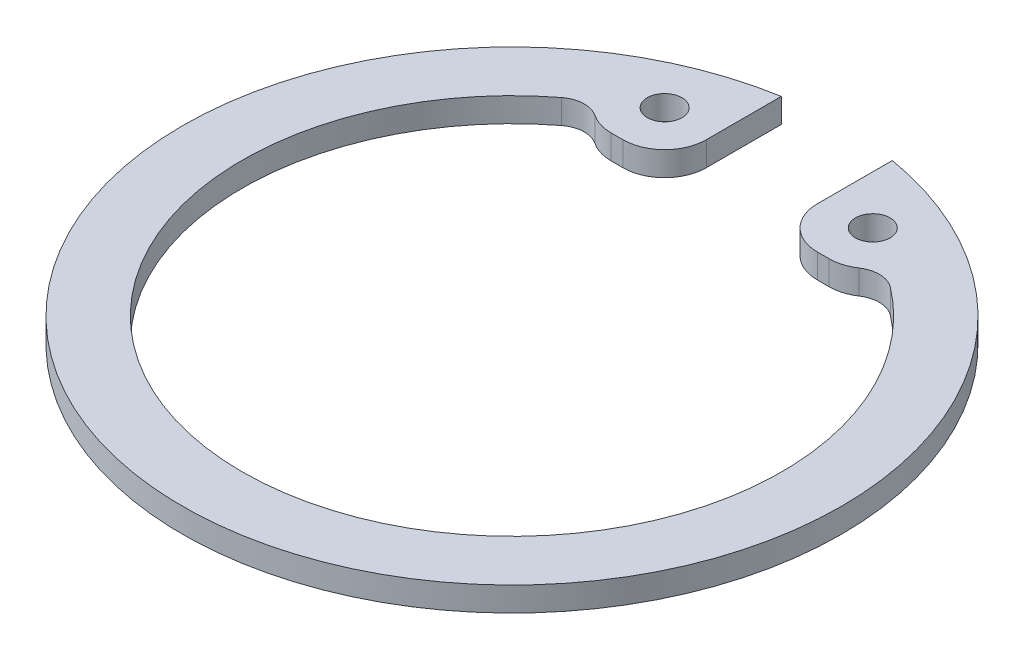
ISO-10303-21;
HEADER;
FILE_DESCRIPTION(('STEP AP214'),'2;1');
FILE_NAME('part.step','',(''),(''),'','','');
FILE_SCHEMA(('AUTOMOTIVE_DESIGN { 1 0 10303 214 1 1 1 1 }'));
ENDSEC;
DATA;
#1=APPLICATION_CONTEXT('core data for automotive mechanical design processes');
#2=APPLICATION_PROTOCOL_DEFINITION('international standard','automotive_design',2000,#1);
#3=PRODUCT_CONTEXT('',#1,'mechanical');
#4=PRODUCT('Part','Part','',(#3));
#5=PRODUCT_RELATED_PRODUCT_CATEGORY('part','',(#4));
#6=PRODUCT_DEFINITION_FORMATION('','',#4);
#7=PRODUCT_DEFINITION_CONTEXT('part definition',#1,'design');
#8=PRODUCT_DEFINITION('design','',#6,#7);
#9=PRODUCT_DEFINITION_SHAPE('','',#8);
#10=(LENGTH_UNIT() NAMED_UNIT(*) SI_UNIT(.MILLI.,.METRE.));
#11=(NAMED_UNIT(*) PLANE_ANGLE_UNIT() SI_UNIT($,.RADIAN.));
#12=(NAMED_UNIT(*) SI_UNIT($,.STERADIAN.) SOLID_ANGLE_UNIT());
#13=UNCERTAINTY_MEASURE_WITH_UNIT(LENGTH_MEASURE(1.E-05),#10,'distance_accuracy_value','');
#14=(GEOMETRIC_REPRESENTATION_CONTEXT(3) GLOBAL_UNCERTAINTY_ASSIGNED_CONTEXT((#13)) GLOBAL_UNIT_ASSIGNED_CONTEXT((#10,
#11,#12)) REPRESENTATION_CONTEXT('',''));
#15=CARTESIAN_POINT('',(0.,0.,0.));
#16=DIRECTION('',(0.,0.,1.));
#17=DIRECTION('',(1.,0.,0.));
#18=AXIS2_PLACEMENT_3D('',#15,#16,#17);
#19=CARTESIAN_POINT('',(-4.,1.75,-15.));
#20=DIRECTION('',(0.,0.,-1.));
#21=DIRECTION('',(-1.,0.,0.));
#22=AXIS2_PLACEMENT_3D('',#19,#20,#21);
#23=PLANE('',#22);
#24=DIRECTION('',(1.,0.,0.));
#25=VECTOR('',#24,1.);
#26=CARTESIAN_POINT('',(-4.,0.,-15.));
#27=LINE('',#26,#25);
#28=CARTESIAN_POINT('',(-7.85579068601217,0.,-15.));
#29=VERTEX_POINT('',#28);
#30=CARTESIAN_POINT('',(-7.,0.,-15.));
#31=VERTEX_POINT('',#30);
#32=EDGE_CURVE('E165',#29,#31,#27,.T.);
#33=ORIENTED_EDGE('',*,*,#32,.T.);
#34=DIRECTION('',(0.,-1.,0.));
#35=VECTOR('',#34,1.);
#36=CARTESIAN_POINT('',(-7.,1.75,-15.));
#37=LINE('',#36,#35);
#38=CARTESIAN_POINT('',(-7.,1.75,-15.));
#39=VERTEX_POINT('',#38);
#40=EDGE_CURVE('E45',#31,#39,#37,.F.);
#41=ORIENTED_EDGE('',*,*,#40,.T.);
#42=DIRECTION('',(1.,0.,0.));
#43=VECTOR('',#42,1.);
#44=CARTESIAN_POINT('',(-4.,1.75,-15.));
#45=LINE('',#44,#43);
#46=CARTESIAN_POINT('',(-7.85579068601217,1.75,-15.));
#47=VERTEX_POINT('',#46);
#48=EDGE_CURVE('E140',#47,#39,#45,.T.);
#49=ORIENTED_EDGE('',*,*,#48,.F.);
#50=DIRECTION('',(0.,-1.,0.));
#51=VECTOR('',#50,1.);
#52=CARTESIAN_POINT('',(-7.85579068601217,1.75,-15.));
#53=LINE('',#52,#51);
#54=EDGE_CURVE('E220',#47,#29,#53,.T.);
#55=ORIENTED_EDGE('',*,*,#54,.T.);
#56=EDGE_LOOP('',(#33,#41,#49,#55));
#57=FACE_BOUND('',#56,.T.);
#58=ADVANCED_FACE('F37',(#57),#23,.F.);
#59=CARTESIAN_POINT('',(-4.,1.75,-23.4107347172189));
#60=DIRECTION('',(-1.,0.,0.));
#61=DIRECTION('',(0.,0.,1.));
#62=AXIS2_PLACEMENT_3D('',#59,#60,#61);
#63=PLANE('',#62);
#64=DIRECTION('',(0.,0.,-1.));
#65=VECTOR('',#64,1.);
#66=CARTESIAN_POINT('',(-4.,1.75,-19.0342454539181));
#67=LINE('',#66,#65);
#68=CARTESIAN_POINT('',(-4.,1.75,-18.));
#69=VERTEX_POINT('',#68);
#70=CARTESIAN_POINT('',(-4.,1.75,-23.4107347172189));
#71=VERTEX_POINT('',#70);
#72=EDGE_CURVE('E127',#69,#71,#67,.T.);
#73=ORIENTED_EDGE('',*,*,#72,.F.);
#74=DIRECTION('',(0.,-1.,0.));
#75=VECTOR('',#74,1.);
#76=CARTESIAN_POINT('',(-4.,1.75,-18.));
#77=LINE('',#76,#75);
#78=CARTESIAN_POINT('',(-4.,0.,-18.));
#79=VERTEX_POINT('',#78);
#80=EDGE_CURVE('E218',#69,#79,#77,.T.);
#81=ORIENTED_EDGE('',*,*,#80,.T.);
#82=DIRECTION('',(0.,0.,-1.));
#83=VECTOR('',#82,1.);
#84=CARTESIAN_POINT('',(-4.,0.,-23.4107347172189));
#85=LINE('',#84,#83);
#86=CARTESIAN_POINT('',(-4.,0.,-23.4107347172189));
#87=VERTEX_POINT('',#86);
#88=EDGE_CURVE('E146',#79,#87,#85,.T.);
#89=ORIENTED_EDGE('',*,*,#88,.T.);
#90=DIRECTION('',(0.,-1.,0.));
#91=VECTOR('',#90,1.);
#92=CARTESIAN_POINT('',(-4.,1.75,-23.4107347172189));
#93=LINE('',#92,#91);
#94=EDGE_CURVE('E143',#71,#87,#93,.T.);
#95=ORIENTED_EDGE('',*,*,#94,.F.);
#96=EDGE_LOOP('',(#73,#81,#89,#95));
#97=FACE_BOUND('',#96,.T.);
#98=ADVANCED_FACE('F144',(#97),#63,.F.);
#99=CARTESIAN_POINT('',(0.,1.75,0.));
#100=DIRECTION('',(0.,-1.,0.));
#101=DIRECTION('',(0.,0.,-1.));
#102=AXIS2_PLACEMENT_3D('',#99,#100,#101);
#103=CYLINDRICAL_SURFACE('',#102,23.75);
#104=CARTESIAN_POINT('',(0.,0.,0.));
#105=DIRECTION('',(0.,1.,0.));
#106=DIRECTION('',(0.,0.,1.));
#107=AXIS2_PLACEMENT_3D('',#104,#105,#106);
#108=CIRCLE('',#107,23.75);
#109=CARTESIAN_POINT('',(3.99999999999998,0.,-23.4107347172189));
#110=VERTEX_POINT('',#109);
#111=EDGE_CURVE('E170',#87,#110,#108,.T.);
#112=ORIENTED_EDGE('',*,*,#111,.T.);
#113=DIRECTION('',(0.,-1.,0.));
#114=VECTOR('',#113,1.);
#115=CARTESIAN_POINT('',(3.99999999999998,1.75,-23.4107347172189));
#116=LINE('',#115,#114);
#117=CARTESIAN_POINT('',(3.99999999999998,1.75,-23.4107347172189));
#118=VERTEX_POINT('',#117);
#119=EDGE_CURVE('E151',#118,#110,#116,.T.);
#120=ORIENTED_EDGE('',*,*,#119,.F.);
#121=CARTESIAN_POINT('',(0.,1.75,0.));
#122=DIRECTION('',(0.,1.,0.));
#123=DIRECTION('',(0.,0.,1.));
#124=AXIS2_PLACEMENT_3D('',#121,#122,#123);
#125=CIRCLE('',#124,23.75);
#126=EDGE_CURVE('E132',#71,#118,#125,.T.);
#127=ORIENTED_EDGE('',*,*,#126,.F.);
#128=ORIENTED_EDGE('',*,*,#94,.T.);
#129=EDGE_LOOP('',(#112,#120,#127,#128));
#130=FACE_BOUND('',#129,.T.);
#131=ADVANCED_FACE('F153',(#130),#103,.T.);
#132=CARTESIAN_POINT('',(4.,1.75,-19.034245453918));
#133=DIRECTION('',(1.,0.,0.));
#134=DIRECTION('',(0.,0.,-1.));
#135=AXIS2_PLACEMENT_3D('',#132,#133,#134);
#136=PLANE('',#135);
#137=DIRECTION('',(0.,0.,1.));
#138=VECTOR('',#137,1.);
#139=CARTESIAN_POINT('',(4.,0.,-19.034245453918));
#140=LINE('',#139,#138);
#141=CARTESIAN_POINT('',(4.,0.,-18.));
#142=VERTEX_POINT('',#141);
#143=EDGE_CURVE('E172',#110,#142,#140,.T.);
#144=ORIENTED_EDGE('',*,*,#143,.T.);
#145=DIRECTION('',(0.,-1.,0.));
#146=VECTOR('',#145,1.);
#147=CARTESIAN_POINT('',(4.,1.75,-18.));
#148=LINE('',#147,#146);
#149=CARTESIAN_POINT('',(4.,1.75,-18.));
#150=VERTEX_POINT('',#149);
#151=EDGE_CURVE('E58',#142,#150,#148,.F.);
#152=ORIENTED_EDGE('',*,*,#151,.T.);
#153=DIRECTION('',(0.,0.,1.));
#154=VECTOR('',#153,1.);
#155=CARTESIAN_POINT('',(4.,1.75,-23.4107347172189));
#156=LINE('',#155,#154);
#157=EDGE_CURVE('E155',#118,#150,#156,.T.);
#158=ORIENTED_EDGE('',*,*,#157,.F.);
#159=ORIENTED_EDGE('',*,*,#119,.T.);
#160=EDGE_LOOP('',(#144,#152,#158,#159));
#161=FACE_BOUND('',#160,.T.);
#162=ADVANCED_FACE('F232',(#161),#136,.F.);
#163=CARTESIAN_POINT('',(4.,1.75,-15.));
#164=DIRECTION('',(0.,0.,-1.));
#165=DIRECTION('',(-1.,0.,0.));
#166=AXIS2_PLACEMENT_3D('',#163,#164,#165);
#167=PLANE('',#166);
#168=DIRECTION('',(1.,0.,0.));
#169=VECTOR('',#168,1.);
#170=CARTESIAN_POINT('',(4.,0.,-15.));
#171=LINE('',#170,#169);
#172=CARTESIAN_POINT('',(7.,0.,-15.));
#173=VERTEX_POINT('',#172);
#174=CARTESIAN_POINT('',(7.85579068601215,0.,-15.));
#175=VERTEX_POINT('',#174);
#176=EDGE_CURVE('E174',#173,#175,#171,.T.);
#177=ORIENTED_EDGE('',*,*,#176,.T.);
#178=DIRECTION('',(0.,-1.,0.));
#179=VECTOR('',#178,1.);
#180=CARTESIAN_POINT('',(7.85579068601215,1.75,-15.));
#181=LINE('',#180,#179);
#182=CARTESIAN_POINT('',(7.85579068601215,1.75,-15.));
#183=VERTEX_POINT('',#182);
#184=EDGE_CURVE('E208',#175,#183,#181,.F.);
#185=ORIENTED_EDGE('',*,*,#184,.T.);
#186=DIRECTION('',(1.,0.,0.));
#187=VECTOR('',#186,1.);
#188=CARTESIAN_POINT('',(4.,1.75,-15.));
#189=LINE('',#188,#187);
#190=CARTESIAN_POINT('',(7.,1.75,-15.));
#191=VERTEX_POINT('',#190);
#192=EDGE_CURVE('E157',#191,#183,#189,.T.);
#193=ORIENTED_EDGE('',*,*,#192,.F.);
#194=DIRECTION('',(0.,-1.,0.));
#195=VECTOR('',#194,1.);
#196=CARTESIAN_POINT('',(7.,1.75,-15.));
#197=LINE('',#196,#195);
#198=EDGE_CURVE('E205',#191,#173,#197,.T.);
#199=ORIENTED_EDGE('',*,*,#198,.T.);
#200=EDGE_LOOP('',(#177,#185,#193,#199));
#201=FACE_BOUND('',#200,.T.);
#202=ADVANCED_FACE('F240',(#201),#167,.F.);
#203=CARTESIAN_POINT('',(0.,1.75,0.));
#204=DIRECTION('',(0.,-1.,0.));
#205=DIRECTION('',(0.,0.,-1.));
#206=AXIS2_PLACEMENT_3D('',#203,#204,#205);
#207=CYLINDRICAL_SURFACE('',#206,19.45);
#208=CARTESIAN_POINT('',(0.,1.75,0.));
#209=DIRECTION('',(0.,-1.,0.));
#210=DIRECTION('',(0.,0.,1.));
#211=AXIS2_PLACEMENT_3D('',#208,#209,#210);
#212=CIRCLE('',#211,19.45);
#213=CARTESIAN_POINT('',(11.847043879474,1.75,-15.4256296895076));
#214=VERTEX_POINT('',#213);
#215=CARTESIAN_POINT('',(-11.847043879474,1.75,-15.4256296895076));
#216=VERTEX_POINT('',#215);
#217=EDGE_CURVE('E162',#214,#216,#212,.T.);
#218=ORIENTED_EDGE('',*,*,#217,.F.);
#219=DIRECTION('',(0.,-1.,0.));
#220=VECTOR('',#219,1.);
#221=CARTESIAN_POINT('',(11.847043879474,1.75,-15.4256296895076));
#222=LINE('',#221,#220);
#223=CARTESIAN_POINT('',(11.847043879474,0.,-15.4256296895076));
#224=VERTEX_POINT('',#223);
#225=EDGE_CURVE('E182',#214,#224,#222,.T.);
#226=ORIENTED_EDGE('',*,*,#225,.T.);
#227=CARTESIAN_POINT('',(0.,0.,0.));
#228=DIRECTION('',(0.,-1.,0.));
#229=DIRECTION('',(0.,0.,1.));
#230=AXIS2_PLACEMENT_3D('',#227,#228,#229);
#231=CIRCLE('',#230,19.45);
#232=CARTESIAN_POINT('',(-11.847043879474,0.,-15.4256296895076));
#233=VERTEX_POINT('',#232);
#234=EDGE_CURVE('E177',#224,#233,#231,.T.);
#235=ORIENTED_EDGE('',*,*,#234,.T.);
#236=DIRECTION('',(0.,-1.,0.));
#237=VECTOR('',#236,1.);
#238=CARTESIAN_POINT('',(-11.847043879474,1.75,-15.4256296895076));
#239=LINE('',#238,#237);
#240=EDGE_CURVE('E150',#233,#216,#239,.F.);
#241=ORIENTED_EDGE('',*,*,#240,.T.);
#242=EDGE_LOOP('',(#218,#226,#235,#241));
#243=FACE_BOUND('',#242,.T.);
#244=ADVANCED_FACE('F253',(#243),#207,.F.);
#245=CARTESIAN_POINT('',(0.,1.75,0.));
#246=DIRECTION('',(0.,1.,0.));
#247=DIRECTION('',(0.,0.,1.));
#248=AXIS2_PLACEMENT_3D('',#245,#246,#247);
#249=PLANE('',#248);
#250=CARTESIAN_POINT('',(-7.5,1.75,-18.5));
#251=DIRECTION('',(0.,1.,0.));
#252=DIRECTION('',(0.,0.,1.));
#253=AXIS2_PLACEMENT_3D('',#250,#251,#252);
#254=CIRCLE('',#253,1.25);
#255=CARTESIAN_POINT('',(-7.5,1.75,-17.25));
#256=VERTEX_POINT('',#255);
#257=EDGE_CURVE('E400',#256,#256,#254,.T.);
#258=ORIENTED_EDGE('',*,*,#257,.F.);
#259=EDGE_LOOP('',(#258));
#260=FACE_BOUND('',#259,.T.);
#261=CARTESIAN_POINT('',(7.5,1.75,-18.5));
#262=DIRECTION('',(0.,1.,0.));
#263=DIRECTION('',(0.,0.,1.));
#264=AXIS2_PLACEMENT_3D('',#261,#262,#263);
#265=CIRCLE('',#264,1.25);
#266=CARTESIAN_POINT('',(7.5,1.75,-17.25));
#267=VERTEX_POINT('',#266);
#268=EDGE_CURVE('E405',#267,#267,#265,.T.);
#269=ORIENTED_EDGE('',*,*,#268,.F.);
#270=EDGE_LOOP('',(#269));
#271=FACE_BOUND('',#270,.T.);
#272=ORIENTED_EDGE('',*,*,#192,.T.);
#273=CARTESIAN_POINT('',(7.85579068601215,1.75,-18.));
#274=DIRECTION('',(0.,1.,0.));
#275=DIRECTION('',(0.,0.,1.));
#276=AXIS2_PLACEMENT_3D('',#273,#274,#275);
#277=CIRCLE('',#276,3.);
#278=CARTESIAN_POINT('',(9.51961958638906,1.75,-15.5036680128095));
#279=VERTEX_POINT('',#278);
#280=EDGE_CURVE('E215',#183,#279,#277,.T.);
#281=ORIENTED_EDGE('',*,*,#280,.T.);
#282=CARTESIAN_POINT('',(10.628838853307,1.75,-13.8394466880158));
#283=DIRECTION('',(0.,1.,0.));
#284=DIRECTION('',(0.,0.,1.));
#285=AXIS2_PLACEMENT_3D('',#282,#283,#284);
#286=CIRCLE('',#285,2.);
#287=EDGE_CURVE('E188',#279,#214,#286,.F.);
#288=ORIENTED_EDGE('',*,*,#287,.T.);
#289=ORIENTED_EDGE('',*,*,#217,.T.);
#290=CARTESIAN_POINT('',(-10.628838853307,1.75,-13.8394466880158));
#291=DIRECTION('',(0.,1.,0.));
#292=DIRECTION('',(0.,0.,1.));
#293=AXIS2_PLACEMENT_3D('',#290,#291,#292);
#294=CIRCLE('',#293,2.);
#295=CARTESIAN_POINT('',(-9.51961958638907,1.75,-15.5036680128095));
#296=VERTEX_POINT('',#295);
#297=EDGE_CURVE('E192',#216,#296,#294,.F.);
#298=ORIENTED_EDGE('',*,*,#297,.T.);
#299=CARTESIAN_POINT('',(-7.85579068601217,1.75,-18.));
#300=DIRECTION('',(0.,1.,0.));
#301=DIRECTION('',(0.,0.,1.));
#302=AXIS2_PLACEMENT_3D('',#299,#300,#301);
#303=CIRCLE('',#302,3.);
#304=EDGE_CURVE('E210',#296,#47,#303,.T.);
#305=ORIENTED_EDGE('',*,*,#304,.T.);
#306=ORIENTED_EDGE('',*,*,#48,.T.);
#307=CARTESIAN_POINT('',(-7.,1.75,-18.));
#308=DIRECTION('',(0.,1.,0.));
#309=DIRECTION('',(0.,0.,1.));
#310=AXIS2_PLACEMENT_3D('',#307,#308,#309);
#311=CIRCLE('',#310,3.);
#312=EDGE_CURVE('E136',#39,#69,#311,.T.);
#313=ORIENTED_EDGE('',*,*,#312,.T.);
#314=ORIENTED_EDGE('',*,*,#72,.T.);
#315=ORIENTED_EDGE('',*,*,#126,.T.);
#316=ORIENTED_EDGE('',*,*,#157,.T.);
#317=CARTESIAN_POINT('',(7.,1.75,-18.));
#318=DIRECTION('',(0.,1.,0.));
#319=DIRECTION('',(0.,0.,1.));
#320=AXIS2_PLACEMENT_3D('',#317,#318,#319);
#321=CIRCLE('',#320,3.);
#322=EDGE_CURVE('E213',#150,#191,#321,.T.);
#323=ORIENTED_EDGE('',*,*,#322,.T.);
#324=EDGE_LOOP('',(#272,#281,#288,#289,#298,#305,#306,#313,#314,#315,#316,#323));
#325=FACE_BOUND('',#324,.T.);
#326=ADVANCED_FACE('F130',(#260,#271,#325),#249,.T.);
#327=CARTESIAN_POINT('',(0.,0.,0.));
#328=DIRECTION('',(0.,1.,0.));
#329=DIRECTION('',(0.,0.,1.));
#330=AXIS2_PLACEMENT_3D('',#327,#328,#329);
#331=PLANE('',#330);
#332=CARTESIAN_POINT('',(-7.5,0.,-18.5));
#333=DIRECTION('',(0.,1.,0.));
#334=DIRECTION('',(0.,0.,1.));
#335=AXIS2_PLACEMENT_3D('',#332,#333,#334);
#336=CIRCLE('',#335,1.25);
#337=CARTESIAN_POINT('',(-7.5,0.,-17.25));
#338=VERTEX_POINT('',#337);
#339=EDGE_CURVE('E168',#338,#338,#336,.T.);
#340=ORIENTED_EDGE('',*,*,#339,.T.);
#341=EDGE_LOOP('',(#340));
#342=FACE_BOUND('',#341,.T.);
#343=CARTESIAN_POINT('',(7.5,0.,-18.5));
#344=DIRECTION('',(0.,1.,0.));
#345=DIRECTION('',(0.,0.,1.));
#346=AXIS2_PLACEMENT_3D('',#343,#344,#345);
#347=CIRCLE('',#346,1.25);
#348=CARTESIAN_POINT('',(7.5,0.,-17.25));
#349=VERTEX_POINT('',#348);
#350=EDGE_CURVE('E401',#349,#349,#347,.T.);
#351=ORIENTED_EDGE('',*,*,#350,.T.);
#352=EDGE_LOOP('',(#351));
#353=FACE_BOUND('',#352,.T.);
#354=CARTESIAN_POINT('',(10.628838853307,0.,-13.8394466880158));
#355=DIRECTION('',(0.,1.,0.));
#356=DIRECTION('',(0.,0.,1.));
#357=AXIS2_PLACEMENT_3D('',#354,#355,#356);
#358=CIRCLE('',#357,2.);
#359=CARTESIAN_POINT('',(9.51961958638906,0.,-15.5036680128095));
#360=VERTEX_POINT('',#359);
#361=EDGE_CURVE('E185',#224,#360,#358,.T.);
#362=ORIENTED_EDGE('',*,*,#361,.T.);
#363=CARTESIAN_POINT('',(7.85579068601215,0.,-18.));
#364=DIRECTION('',(0.,1.,0.));
#365=DIRECTION('',(0.,0.,1.));
#366=AXIS2_PLACEMENT_3D('',#363,#364,#365);
#367=CIRCLE('',#366,3.);
#368=EDGE_CURVE('E203',#360,#175,#367,.F.);
#369=ORIENTED_EDGE('',*,*,#368,.T.);
#370=ORIENTED_EDGE('',*,*,#176,.F.);
#371=CARTESIAN_POINT('',(7.,0.,-18.));
#372=DIRECTION('',(0.,1.,0.));
#373=DIRECTION('',(0.,0.,1.));
#374=AXIS2_PLACEMENT_3D('',#371,#372,#373);
#375=CIRCLE('',#374,3.);
#376=EDGE_CURVE('E201',#173,#142,#375,.F.);
#377=ORIENTED_EDGE('',*,*,#376,.T.);
#378=ORIENTED_EDGE('',*,*,#143,.F.);
#379=ORIENTED_EDGE('',*,*,#111,.F.);
#380=ORIENTED_EDGE('',*,*,#88,.F.);
#381=CARTESIAN_POINT('',(-7.,0.,-18.));
#382=DIRECTION('',(0.,1.,0.));
#383=DIRECTION('',(0.,0.,1.));
#384=AXIS2_PLACEMENT_3D('',#381,#382,#383);
#385=CIRCLE('',#384,3.);
#386=EDGE_CURVE('E199',#79,#31,#385,.F.);
#387=ORIENTED_EDGE('',*,*,#386,.T.);
#388=ORIENTED_EDGE('',*,*,#32,.F.);
#389=CARTESIAN_POINT('',(-7.85579068601217,0.,-18.));
#390=DIRECTION('',(0.,1.,0.));
#391=DIRECTION('',(0.,0.,1.));
#392=AXIS2_PLACEMENT_3D('',#389,#390,#391);
#393=CIRCLE('',#392,3.);
#394=CARTESIAN_POINT('',(-9.51961958638907,0.,-15.5036680128095));
#395=VERTEX_POINT('',#394);
#396=EDGE_CURVE('E197',#29,#395,#393,.F.);
#397=ORIENTED_EDGE('',*,*,#396,.T.);
#398=CARTESIAN_POINT('',(-10.628838853307,0.,-13.8394466880158));
#399=DIRECTION('',(0.,1.,0.));
#400=DIRECTION('',(0.,0.,1.));
#401=AXIS2_PLACEMENT_3D('',#398,#399,#400);
#402=CIRCLE('',#401,2.);
#403=EDGE_CURVE('E190',#395,#233,#402,.T.);
#404=ORIENTED_EDGE('',*,*,#403,.T.);
#405=ORIENTED_EDGE('',*,*,#234,.F.);
#406=EDGE_LOOP('',(#362,#369,#370,#377,#378,#379,#380,#387,#388,#397,#404,#405));
#407=FACE_BOUND('',#406,.T.);
#408=ADVANCED_FACE('F231',(#342,#353,#407),#331,.F.);
#409=CARTESIAN_POINT('',(10.628838853307,1.75,-13.8394466880158));
#410=DIRECTION('',(0.,-1.,0.));
#411=DIRECTION('',(0.,0.,-1.));
#412=AXIS2_PLACEMENT_3D('',#409,#410,#411);
#413=CYLINDRICAL_SURFACE('',#412,2.);
#414=ORIENTED_EDGE('',*,*,#287,.F.);
#415=DIRECTION('',(0.,-1.,0.));
#416=VECTOR('',#415,1.);
#417=CARTESIAN_POINT('',(9.51961958638906,1.75,-15.5036680128095));
#418=LINE('',#417,#416);
#419=EDGE_CURVE('E194',#279,#360,#418,.T.);
#420=ORIENTED_EDGE('',*,*,#419,.T.);
#421=ORIENTED_EDGE('',*,*,#361,.F.);
#422=ORIENTED_EDGE('',*,*,#225,.F.);
#423=EDGE_LOOP('',(#414,#420,#421,#422));
#424=FACE_BOUND('',#423,.T.);
#425=ADVANCED_FACE('F249',(#424),#413,.F.);
#426=CARTESIAN_POINT('',(-10.628838853307,1.75,-13.8394466880158));
#427=DIRECTION('',(0.,-1.,0.));
#428=DIRECTION('',(0.,0.,-1.));
#429=AXIS2_PLACEMENT_3D('',#426,#427,#428);
#430=CYLINDRICAL_SURFACE('',#429,2.);
#431=ORIENTED_EDGE('',*,*,#403,.F.);
#432=DIRECTION('',(0.,-1.,0.));
#433=VECTOR('',#432,1.);
#434=CARTESIAN_POINT('',(-9.51961958638907,1.75,-15.5036680128095));
#435=LINE('',#434,#433);
#436=EDGE_CURVE('E11',#395,#296,#435,.F.);
#437=ORIENTED_EDGE('',*,*,#436,.T.);
#438=ORIENTED_EDGE('',*,*,#297,.F.);
#439=ORIENTED_EDGE('',*,*,#240,.F.);
#440=EDGE_LOOP('',(#431,#437,#438,#439));
#441=FACE_BOUND('',#440,.T.);
#442=ADVANCED_FACE('F255',(#441),#430,.F.);
#443=CARTESIAN_POINT('',(7.85579068601215,1.75,-18.));
#444=DIRECTION('',(0.,-1.,0.));
#445=DIRECTION('',(0.,0.,-1.));
#446=AXIS2_PLACEMENT_3D('',#443,#444,#445);
#447=CYLINDRICAL_SURFACE('',#446,3.);
#448=ORIENTED_EDGE('',*,*,#280,.F.);
#449=ORIENTED_EDGE('',*,*,#184,.F.);
#450=ORIENTED_EDGE('',*,*,#368,.F.);
#451=ORIENTED_EDGE('',*,*,#419,.F.);
#452=EDGE_LOOP('',(#448,#449,#450,#451));
#453=FACE_BOUND('',#452,.T.);
#454=ADVANCED_FACE('F246',(#453),#447,.T.);
#455=CARTESIAN_POINT('',(7.,1.75,-18.));
#456=DIRECTION('',(0.,-1.,0.));
#457=DIRECTION('',(0.,0.,-1.));
#458=AXIS2_PLACEMENT_3D('',#455,#456,#457);
#459=CYLINDRICAL_SURFACE('',#458,3.);
#460=ORIENTED_EDGE('',*,*,#322,.F.);
#461=ORIENTED_EDGE('',*,*,#151,.F.);
#462=ORIENTED_EDGE('',*,*,#376,.F.);
#463=ORIENTED_EDGE('',*,*,#198,.F.);
#464=EDGE_LOOP('',(#460,#461,#462,#463));
#465=FACE_BOUND('',#464,.T.);
#466=ADVANCED_FACE('F237',(#465),#459,.T.);
#467=CARTESIAN_POINT('',(-7.,1.75,-18.));
#468=DIRECTION('',(0.,-1.,0.));
#469=DIRECTION('',(0.,0.,-1.));
#470=AXIS2_PLACEMENT_3D('',#467,#468,#469);
#471=CYLINDRICAL_SURFACE('',#470,3.);
#472=ORIENTED_EDGE('',*,*,#312,.F.);
#473=ORIENTED_EDGE('',*,*,#40,.F.);
#474=ORIENTED_EDGE('',*,*,#386,.F.);
#475=ORIENTED_EDGE('',*,*,#80,.F.);
#476=EDGE_LOOP('',(#472,#473,#474,#475));
#477=FACE_BOUND('',#476,.T.);
#478=ADVANCED_FACE('F229',(#477),#471,.T.);
#479=CARTESIAN_POINT('',(-7.85579068601217,1.75,-18.));
#480=DIRECTION('',(0.,-1.,0.));
#481=DIRECTION('',(0.,0.,-1.));
#482=AXIS2_PLACEMENT_3D('',#479,#480,#481);
#483=CYLINDRICAL_SURFACE('',#482,3.);
#484=ORIENTED_EDGE('',*,*,#304,.F.);
#485=ORIENTED_EDGE('',*,*,#436,.F.);
#486=ORIENTED_EDGE('',*,*,#396,.F.);
#487=ORIENTED_EDGE('',*,*,#54,.F.);
#488=EDGE_LOOP('',(#484,#485,#486,#487));
#489=FACE_BOUND('',#488,.T.);
#490=ADVANCED_FACE('F39',(#489),#483,.T.);
#491=CARTESIAN_POINT('',(7.5,0.,-18.5));
#492=DIRECTION('',(0.,1.,0.));
#493=DIRECTION('',(0.,0.,1.));
#494=AXIS2_PLACEMENT_3D('',#491,#492,#493);
#495=CYLINDRICAL_SURFACE('',#494,1.25);
#496=ORIENTED_EDGE('',*,*,#350,.F.);
#497=EDGE_LOOP('',(#496));
#498=FACE_BOUND('',#497,.T.);
#499=ORIENTED_EDGE('',*,*,#268,.T.);
#500=EDGE_LOOP('',(#499));
#501=FACE_BOUND('',#500,.T.);
#502=ADVANCED_FACE('F258',(#498,#501),#495,.F.);
#503=CARTESIAN_POINT('',(-7.5,0.,-18.5));
#504=DIRECTION('',(0.,1.,0.));
#505=DIRECTION('',(0.,0.,1.));
#506=AXIS2_PLACEMENT_3D('',#503,#504,#505);
#507=CYLINDRICAL_SURFACE('',#506,1.25);
#508=ORIENTED_EDGE('',*,*,#339,.F.);
#509=EDGE_LOOP('',(#508));
#510=FACE_BOUND('',#509,.T.);
#511=ORIENTED_EDGE('',*,*,#257,.T.);
#512=EDGE_LOOP('',(#511));
#513=FACE_BOUND('',#512,.T.);
#514=ADVANCED_FACE('F263',(#510,#513),#507,.F.);
#515=CLOSED_SHELL('',(#58,#98,#131,#162,#202,#244,#326,#408,#425,#442,#454,#466,#478,#490,#502,#514));
#516=MANIFOLD_SOLID_BREP('B2',#515);
#517=ADVANCED_BREP_SHAPE_REPRESENTATION('',(#18,#516),#14);
#518=SHAPE_DEFINITION_REPRESENTATION(#9,#517);
ENDSEC;
END-ISO-10303-21;
